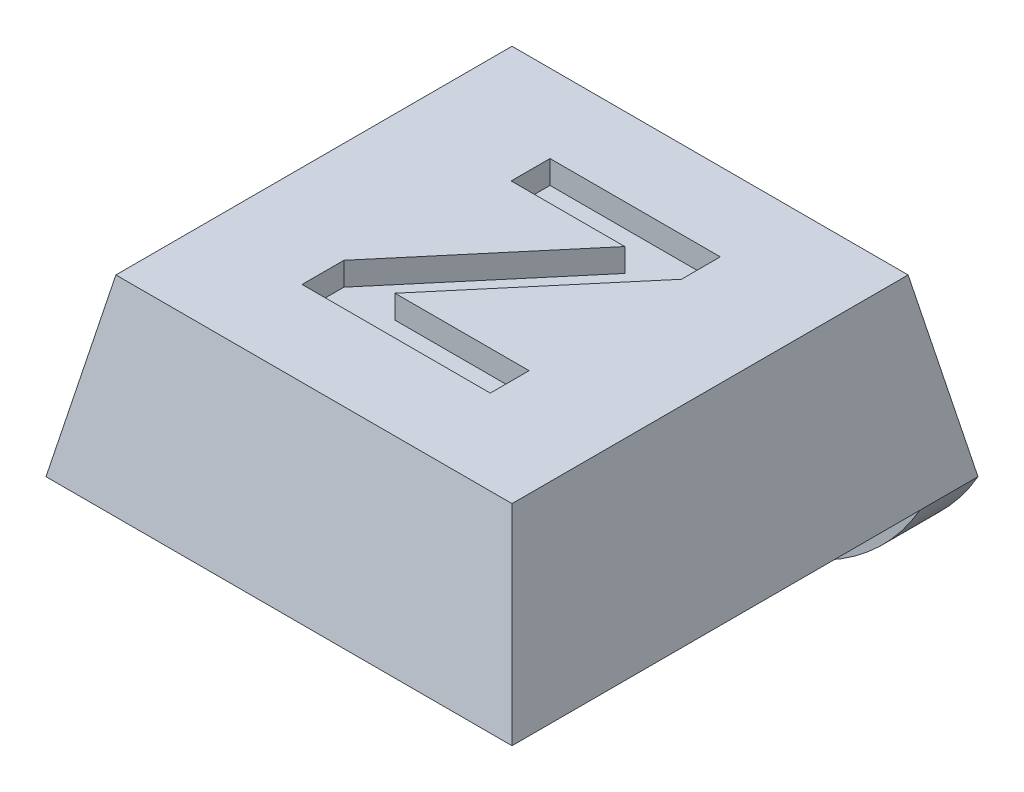
ISO-10303-21;
HEADER;
FILE_DESCRIPTION(('STEP AP214'),'2;1');
FILE_NAME('part.step','',(''),(''),'','','');
FILE_SCHEMA(('AUTOMOTIVE_DESIGN { 1 0 10303 214 1 1 1 1 }'));
ENDSEC;
DATA;
#1=APPLICATION_CONTEXT('core data for automotive mechanical design processes');
#2=APPLICATION_PROTOCOL_DEFINITION('international standard','automotive_design',2000,#1);
#3=PRODUCT_CONTEXT('',#1,'mechanical');
#4=PRODUCT('Part','Part','',(#3));
#5=PRODUCT_RELATED_PRODUCT_CATEGORY('part','',(#4));
#6=PRODUCT_DEFINITION_FORMATION('','',#4);
#7=PRODUCT_DEFINITION_CONTEXT('part definition',#1,'design');
#8=PRODUCT_DEFINITION('design','',#6,#7);
#9=PRODUCT_DEFINITION_SHAPE('','',#8);
#10=(LENGTH_UNIT() NAMED_UNIT(*) SI_UNIT(.MILLI.,.METRE.));
#11=(NAMED_UNIT(*) PLANE_ANGLE_UNIT() SI_UNIT($,.RADIAN.));
#12=(NAMED_UNIT(*) SI_UNIT($,.STERADIAN.) SOLID_ANGLE_UNIT());
#13=UNCERTAINTY_MEASURE_WITH_UNIT(LENGTH_MEASURE(1.E-05),#10,'distance_accuracy_value','');
#14=(GEOMETRIC_REPRESENTATION_CONTEXT(3) GLOBAL_UNCERTAINTY_ASSIGNED_CONTEXT((#13)) GLOBAL_UNIT_ASSIGNED_CONTEXT((#10,
#11,#12)) REPRESENTATION_CONTEXT('',''));
#15=CARTESIAN_POINT('',(0.,0.,0.));
#16=DIRECTION('',(0.,0.,1.));
#17=DIRECTION('',(1.,0.,0.));
#18=AXIS2_PLACEMENT_3D('',#15,#16,#17);
#19=CARTESIAN_POINT('',(0.,3.,0.));
#20=DIRECTION('',(0.,-1.,0.));
#21=DIRECTION('',(0.,0.,-1.));
#22=AXIS2_PLACEMENT_3D('',#19,#20,#21);
#23=PLANE('',#22);
#24=DIRECTION('',(-1.,0.,0.));
#25=VECTOR('',#24,1.);
#26=CARTESIAN_POINT('',(11.,3.,-0.6));
#27=LINE('',#26,#25);
#28=CARTESIAN_POINT('',(7.4,3.,-0.6));
#29=VERTEX_POINT('',#28);
#30=CARTESIAN_POINT('',(0.6,3.,-0.6));
#31=VERTEX_POINT('',#30);
#32=EDGE_CURVE('E218',#29,#31,#27,.T.);
#33=ORIENTED_EDGE('',*,*,#32,.F.);
#34=DIRECTION('',(0.,0.,1.));
#35=VECTOR('',#34,1.);
#36=CARTESIAN_POINT('',(7.4,3.,-8.));
#37=LINE('',#36,#35);
#38=CARTESIAN_POINT('',(7.4,3.,-7.4));
#39=VERTEX_POINT('',#38);
#40=EDGE_CURVE('E231',#39,#29,#37,.T.);
#41=ORIENTED_EDGE('',*,*,#40,.F.);
#42=DIRECTION('',(-1.,0.,0.));
#43=VECTOR('',#42,1.);
#44=CARTESIAN_POINT('',(11.,3.,-7.4));
#45=LINE('',#44,#43);
#46=CARTESIAN_POINT('',(0.599999999999999,3.,-7.4));
#47=VERTEX_POINT('',#46);
#48=EDGE_CURVE('E214',#39,#47,#45,.T.);
#49=ORIENTED_EDGE('',*,*,#48,.T.);
#50=DIRECTION('',(0.,0.,1.));
#51=VECTOR('',#50,1.);
#52=CARTESIAN_POINT('',(0.6,3.,-8.));
#53=LINE('',#52,#51);
#54=EDGE_CURVE('E234',#47,#31,#53,.T.);
#55=ORIENTED_EDGE('',*,*,#54,.T.);
#56=EDGE_LOOP('',(#33,#41,#49,#55));
#57=FACE_BOUND('',#56,.T.);
#58=DIRECTION('',(-1.,0.,0.));
#59=VECTOR('',#58,1.);
#60=CARTESIAN_POINT('',(5.57023744052671,3.,-2.05683246367483));
#61=LINE('',#60,#59);
#62=CARTESIAN_POINT('',(5.57023744052671,3.,-2.05683246367483));
#63=VERTEX_POINT('',#62);
#64=CARTESIAN_POINT('',(2.33946820975748,3.,-2.05683246367483));
#65=VERTEX_POINT('',#64);
#66=EDGE_CURVE('E59',#63,#65,#61,.T.);
#67=ORIENTED_EDGE('',*,*,#66,.T.);
#68=DIRECTION('',(0.,0.,-1.));
#69=VECTOR('',#68,1.);
#70=CARTESIAN_POINT('',(2.33946820975748,3.,-2.05683246367483));
#71=LINE('',#70,#69);
#72=CARTESIAN_POINT('',(2.33946820975748,3.,-2.77478118162354));
#73=VERTEX_POINT('',#72);
#74=EDGE_CURVE('E186',#65,#73,#71,.T.);
#75=ORIENTED_EDGE('',*,*,#74,.T.);
#76=DIRECTION('',(0.644870939209783,0.,-0.764291483507891));
#77=VECTOR('',#76,1.);
#78=CARTESIAN_POINT('',(2.33946820975748,3.,-2.77478118162354));
#79=LINE('',#78,#77);
#80=CARTESIAN_POINT('',(4.54619897898825,3.,-5.39016579700816));
#81=VERTEX_POINT('',#80);
#82=EDGE_CURVE('E625',#73,#81,#79,.T.);
#83=ORIENTED_EDGE('',*,*,#82,.T.);
#84=DIRECTION('',(-1.,0.,0.));
#85=VECTOR('',#84,1.);
#86=CARTESIAN_POINT('',(4.54619897898825,3.,-5.39016579700816));
#87=LINE('',#86,#85);
#88=CARTESIAN_POINT('',(2.59587846616773,3.,-5.39016579700816));
#89=VERTEX_POINT('',#88);
#90=EDGE_CURVE('E627',#81,#89,#87,.T.);
#91=ORIENTED_EDGE('',*,*,#90,.T.);
#92=DIRECTION('',(0.,0.,-1.));
#93=VECTOR('',#92,1.);
#94=CARTESIAN_POINT('',(2.59587846616773,3.,-5.39016579700816));
#95=LINE('',#94,#93);
#96=CARTESIAN_POINT('',(2.59587846616773,3.,-6.05683246367483));
#97=VERTEX_POINT('',#96);
#98=EDGE_CURVE('E632',#89,#97,#95,.T.);
#99=ORIENTED_EDGE('',*,*,#98,.T.);
#100=DIRECTION('',(1.,0.,0.));
#101=VECTOR('',#100,1.);
#102=CARTESIAN_POINT('',(2.59587846616773,3.,-6.05683246367483));
#103=LINE('',#102,#101);
#104=CARTESIAN_POINT('',(5.51895538924466,3.,-6.05683246367483));
#105=VERTEX_POINT('',#104);
#106=EDGE_CURVE('E642',#97,#105,#103,.T.);
#107=ORIENTED_EDGE('',*,*,#106,.T.);
#108=DIRECTION('',(0.,0.,1.));
#109=VECTOR('',#108,1.);
#110=CARTESIAN_POINT('',(5.51895538924466,3.,-6.05683246367483));
#111=LINE('',#110,#109);
#112=CARTESIAN_POINT('',(5.51895538924466,3.,-5.39016579700816));
#113=VERTEX_POINT('',#112);
#114=EDGE_CURVE('E597',#105,#113,#111,.T.);
#115=ORIENTED_EDGE('',*,*,#114,.T.);
#116=DIRECTION('',(-0.645005060359543,0.,0.76417829863886));
#117=VECTOR('',#116,1.);
#118=CARTESIAN_POINT('',(5.51895538924466,3.,-5.39016579700816));
#119=LINE('',#118,#117);
#120=CARTESIAN_POINT('',(3.26815410719337,3.,-2.72349913034149));
#121=VERTEX_POINT('',#120);
#122=EDGE_CURVE('E592',#113,#121,#119,.T.);
#123=ORIENTED_EDGE('',*,*,#122,.T.);
#124=DIRECTION('',(1.,0.,0.));
#125=VECTOR('',#124,1.);
#126=CARTESIAN_POINT('',(3.26815410719337,3.,-2.72349913034149));
#127=LINE('',#126,#125);
#128=CARTESIAN_POINT('',(5.57023744052671,3.,-2.72349913034149));
#129=VERTEX_POINT('',#128);
#130=EDGE_CURVE('E586',#121,#129,#127,.T.);
#131=ORIENTED_EDGE('',*,*,#130,.T.);
#132=DIRECTION('',(0.,0.,1.));
#133=VECTOR('',#132,1.);
#134=CARTESIAN_POINT('',(5.57023744052671,3.,-2.72349913034149));
#135=LINE('',#134,#133);
#136=EDGE_CURVE('E182',#129,#63,#135,.T.);
#137=ORIENTED_EDGE('',*,*,#136,.T.);
#138=EDGE_LOOP('',(#67,#75,#83,#91,#99,#107,#115,#123,#131,#137));
#139=FACE_BOUND('',#138,.T.);
#140=ADVANCED_FACE('F43',(#57,#139),#23,.F.);
#141=CARTESIAN_POINT('',(8.,0.,-8.));
#142=DIRECTION('',(-0.98058067569092,-0.196116135138184,0.));
#143=DIRECTION('',(0.196116135138184,-0.98058067569092,0.));
#144=AXIS2_PLACEMENT_3D('',#141,#142,#143);
#145=PLANE('',#144);
#146=DIRECTION('',(-0.192450089729875,0.962250448649376,-0.192450089729875));
#147=VECTOR('',#146,1.);
#148=CARTESIAN_POINT('',(7.7037037037037,1.48148148148148,-0.296296296296296));
#149=LINE('',#148,#147);
#150=CARTESIAN_POINT('',(8.,0.,0.));
#151=VERTEX_POINT('',#150);
#152=EDGE_CURVE('E228',#151,#29,#149,.T.);
#153=ORIENTED_EDGE('',*,*,#152,.F.);
#154=DIRECTION('',(0.,0.,-1.));
#155=VECTOR('',#154,1.);
#156=CARTESIAN_POINT('',(8.,0.,0.));
#157=LINE('',#156,#155);
#158=CARTESIAN_POINT('',(8.,0.,-7.));
#159=VERTEX_POINT('',#158);
#160=EDGE_CURVE('E247',#151,#159,#157,.T.);
#161=ORIENTED_EDGE('',*,*,#160,.T.);
#162=DIRECTION('',(0.,0.,1.));
#163=VECTOR('',#162,1.);
#164=CARTESIAN_POINT('',(8.,0.,-8.));
#165=LINE('',#164,#163);
#166=CARTESIAN_POINT('',(8.,0.,-8.));
#167=VERTEX_POINT('',#166);
#168=EDGE_CURVE('E188',#167,#159,#165,.T.);
#169=ORIENTED_EDGE('',*,*,#168,.F.);
#170=DIRECTION('',(0.192450089729875,-0.962250448649376,-0.192450089729875));
#171=VECTOR('',#170,1.);
#172=CARTESIAN_POINT('',(8.,0.,-8.));
#173=LINE('',#172,#171);
#174=EDGE_CURVE('E221',#39,#167,#173,.T.);
#175=ORIENTED_EDGE('',*,*,#174,.F.);
#176=ORIENTED_EDGE('',*,*,#40,.T.);
#177=EDGE_LOOP('',(#153,#161,#169,#175,#176));
#178=FACE_BOUND('',#177,.T.);
#179=ADVANCED_FACE('F315',(#178),#145,.F.);
#180=CARTESIAN_POINT('',(0.,0.,-8.));
#181=DIRECTION('',(0.98058067569092,-0.196116135138184,0.));
#182=DIRECTION('',(0.196116135138184,0.98058067569092,0.));
#183=AXIS2_PLACEMENT_3D('',#180,#181,#182);
#184=PLANE('',#183);
#185=DIRECTION('',(-0.192450089729875,-0.962250448649376,0.192450089729875));
#186=VECTOR('',#185,1.);
#187=CARTESIAN_POINT('',(0.296296296296296,1.48148148148148,-0.296296296296296));
#188=LINE('',#187,#186);
#189=CARTESIAN_POINT('',(0.,0.,0.));
#190=VERTEX_POINT('',#189);
#191=EDGE_CURVE('E275',#31,#190,#188,.T.);
#192=ORIENTED_EDGE('',*,*,#191,.F.);
#193=ORIENTED_EDGE('',*,*,#54,.F.);
#194=DIRECTION('',(0.192450089729875,0.962250448649376,0.192450089729875));
#195=VECTOR('',#194,1.);
#196=CARTESIAN_POINT('',(0.,0.,-8.));
#197=LINE('',#196,#195);
#198=CARTESIAN_POINT('',(0.,0.,-8.));
#199=VERTEX_POINT('',#198);
#200=EDGE_CURVE('E246',#199,#47,#197,.T.);
#201=ORIENTED_EDGE('',*,*,#200,.F.);
#202=DIRECTION('',(0.,0.,1.));
#203=VECTOR('',#202,1.);
#204=CARTESIAN_POINT('',(0.,0.,0.));
#205=LINE('',#204,#203);
#206=CARTESIAN_POINT('',(0.,0.,-7.));
#207=VERTEX_POINT('',#206);
#208=EDGE_CURVE('E251',#199,#207,#205,.T.);
#209=ORIENTED_EDGE('',*,*,#208,.T.);
#210=EDGE_CURVE('E238',#207,#190,#205,.T.);
#211=ORIENTED_EDGE('',*,*,#210,.T.);
#212=EDGE_LOOP('',(#192,#193,#201,#209,#211));
#213=FACE_BOUND('',#212,.T.);
#214=ADVANCED_FACE('F299',(#213),#184,.F.);
#215=CARTESIAN_POINT('',(0.,0.,0.));
#216=DIRECTION('',(0.,-1.,0.));
#217=DIRECTION('',(0.,0.,-1.));
#218=AXIS2_PLACEMENT_3D('',#215,#216,#217);
#219=PLANE('',#218);
#220=DIRECTION('',(-1.,0.,0.));
#221=VECTOR('',#220,1.);
#222=CARTESIAN_POINT('',(0.,0.,-7.));
#223=LINE('',#222,#221);
#224=EDGE_CURVE('E194',#159,#207,#223,.T.);
#225=ORIENTED_EDGE('',*,*,#224,.F.);
#226=ORIENTED_EDGE('',*,*,#160,.F.);
#227=DIRECTION('',(1.,0.,0.));
#228=VECTOR('',#227,1.);
#229=CARTESIAN_POINT('',(0.,0.,0.));
#230=LINE('',#229,#228);
#231=EDGE_CURVE('E248',#190,#151,#230,.T.);
#232=ORIENTED_EDGE('',*,*,#231,.F.);
#233=ORIENTED_EDGE('',*,*,#210,.F.);
#234=EDGE_LOOP('',(#225,#226,#232,#233));
#235=FACE_BOUND('',#234,.T.);
#236=CARTESIAN_POINT('',(4.,0.,-3.75));
#237=DIRECTION('',(0.,-1.,0.));
#238=DIRECTION('',(0.,0.,-1.));
#239=AXIS2_PLACEMENT_3D('',#236,#237,#238);
#240=CIRCLE('',#239,1.75);
#241=CARTESIAN_POINT('',(4.,0.,-5.5));
#242=VERTEX_POINT('',#241);
#243=EDGE_CURVE('E206',#242,#242,#240,.T.);
#244=ORIENTED_EDGE('',*,*,#243,.F.);
#245=EDGE_LOOP('',(#244));
#246=FACE_BOUND('',#245,.T.);
#247=ADVANCED_FACE('F310',(#235,#246),#219,.T.);
#248=CARTESIAN_POINT('',(11.,3.,-7.4));
#249=DIRECTION('',(0.,0.196116135138184,-0.98058067569092));
#250=DIRECTION('',(0.,0.98058067569092,0.196116135138184));
#251=AXIS2_PLACEMENT_3D('',#248,#249,#250);
#252=PLANE('',#251);
#253=ORIENTED_EDGE('',*,*,#174,.T.);
#254=DIRECTION('',(-1.,0.,0.));
#255=VECTOR('',#254,1.);
#256=CARTESIAN_POINT('',(0.,0.,-8.));
#257=LINE('',#256,#255);
#258=EDGE_CURVE('E242',#167,#199,#257,.T.);
#259=ORIENTED_EDGE('',*,*,#258,.T.);
#260=ORIENTED_EDGE('',*,*,#200,.T.);
#261=ORIENTED_EDGE('',*,*,#48,.F.);
#262=EDGE_LOOP('',(#253,#259,#260,#261));
#263=FACE_BOUND('',#262,.T.);
#264=ADVANCED_FACE('F294',(#263),#252,.T.);
#265=CARTESIAN_POINT('',(11.,0.,0.));
#266=DIRECTION('',(0.,0.196116135138184,0.98058067569092));
#267=DIRECTION('',(0.,-0.98058067569092,0.196116135138184));
#268=AXIS2_PLACEMENT_3D('',#265,#266,#267);
#269=PLANE('',#268);
#270=ORIENTED_EDGE('',*,*,#152,.T.);
#271=ORIENTED_EDGE('',*,*,#32,.T.);
#272=ORIENTED_EDGE('',*,*,#191,.T.);
#273=ORIENTED_EDGE('',*,*,#231,.T.);
#274=EDGE_LOOP('',(#270,#271,#272,#273));
#275=FACE_BOUND('',#274,.T.);
#276=ADVANCED_FACE('F339',(#275),#269,.T.);
#277=CARTESIAN_POINT('',(4.,0.4,-3.75));
#278=DIRECTION('',(0.,-1.,0.));
#279=DIRECTION('',(0.,0.,-1.));
#280=AXIS2_PLACEMENT_3D('',#277,#278,#279);
#281=CYLINDRICAL_SURFACE('',#280,1.75);
#282=CARTESIAN_POINT('',(4.,0.4,-3.75));
#283=DIRECTION('',(0.,-1.,0.));
#284=DIRECTION('',(0.,0.,-1.));
#285=AXIS2_PLACEMENT_3D('',#282,#283,#284);
#286=CIRCLE('',#285,1.75);
#287=CARTESIAN_POINT('',(4.,0.4,-5.5));
#288=VERTEX_POINT('',#287);
#289=EDGE_CURVE('E210',#288,#288,#286,.T.);
#290=ORIENTED_EDGE('',*,*,#289,.F.);
#291=EDGE_LOOP('',(#290));
#292=FACE_BOUND('',#291,.T.);
#293=ORIENTED_EDGE('',*,*,#243,.T.);
#294=EDGE_LOOP('',(#293));
#295=FACE_BOUND('',#294,.T.);
#296=ADVANCED_FACE('F346',(#292,#295),#281,.F.);
#297=CARTESIAN_POINT('',(4.,0.4,-3.75));
#298=DIRECTION('',(0.,-1.,0.));
#299=DIRECTION('',(0.,0.,-1.));
#300=AXIS2_PLACEMENT_3D('',#297,#298,#299);
#301=PLANE('',#300);
#302=ORIENTED_EDGE('',*,*,#289,.T.);
#303=EDGE_LOOP('',(#302));
#304=FACE_BOUND('',#303,.T.);
#305=ADVANCED_FACE('F350',(#304),#301,.T.);
#306=CARTESIAN_POINT('',(0.,-2.,-8.));
#307=DIRECTION('',(0.,0.,1.));
#308=DIRECTION('',(1.,0.,0.));
#309=AXIS2_PLACEMENT_3D('',#306,#307,#308);
#310=PLANE('',#309);
#311=ORIENTED_EDGE('',*,*,#258,.F.);
#312=CARTESIAN_POINT('',(4.53589838486225,2.,-8.));
#313=DIRECTION('',(0.,0.,1.));
#314=DIRECTION('',(1.,0.,0.));
#315=AXIS2_PLACEMENT_3D('',#312,#313,#314);
#316=CIRCLE('',#315,4.);
#317=CARTESIAN_POINT('',(4.53589838486225,-2.,-8.));
#318=VERTEX_POINT('',#317);
#319=EDGE_CURVE('E11',#167,#318,#316,.F.);
#320=ORIENTED_EDGE('',*,*,#319,.T.);
#321=DIRECTION('',(1.,0.,0.));
#322=VECTOR('',#321,1.);
#323=CARTESIAN_POINT('',(0.,-2.,-8.));
#324=LINE('',#323,#322);
#325=CARTESIAN_POINT('',(3.46410161513775,-2.,-8.));
#326=VERTEX_POINT('',#325);
#327=EDGE_CURVE('E200',#326,#318,#324,.T.);
#328=ORIENTED_EDGE('',*,*,#327,.F.);
#329=CARTESIAN_POINT('',(3.46410161513775,2.,-8.));
#330=DIRECTION('',(0.,0.,1.));
#331=DIRECTION('',(1.,0.,0.));
#332=AXIS2_PLACEMENT_3D('',#329,#330,#331);
#333=CIRCLE('',#332,4.);
#334=EDGE_CURVE('E52',#326,#199,#333,.F.);
#335=ORIENTED_EDGE('',*,*,#334,.T.);
#336=EDGE_LOOP('',(#311,#320,#328,#335));
#337=FACE_BOUND('',#336,.T.);
#338=ADVANCED_FACE('F287',(#337),#310,.F.);
#339=CARTESIAN_POINT('',(0.,-2.,-7.));
#340=DIRECTION('',(0.,0.,-1.));
#341=DIRECTION('',(-1.,0.,0.));
#342=AXIS2_PLACEMENT_3D('',#339,#340,#341);
#343=PLANE('',#342);
#344=DIRECTION('',(-1.,0.,0.));
#345=VECTOR('',#344,1.);
#346=CARTESIAN_POINT('',(0.,-2.,-7.));
#347=LINE('',#346,#345);
#348=CARTESIAN_POINT('',(4.53589838486225,-2.,-7.));
#349=VERTEX_POINT('',#348);
#350=CARTESIAN_POINT('',(3.46410161513775,-2.,-7.));
#351=VERTEX_POINT('',#350);
#352=EDGE_CURVE('E204',#349,#351,#347,.T.);
#353=ORIENTED_EDGE('',*,*,#352,.F.);
#354=CARTESIAN_POINT('',(4.53589838486225,2.,-7.));
#355=DIRECTION('',(0.,0.,-1.));
#356=DIRECTION('',(-1.,0.,0.));
#357=AXIS2_PLACEMENT_3D('',#354,#355,#356);
#358=CIRCLE('',#357,4.);
#359=EDGE_CURVE('E281',#349,#159,#358,.F.);
#360=ORIENTED_EDGE('',*,*,#359,.T.);
#361=ORIENTED_EDGE('',*,*,#224,.T.);
#362=CARTESIAN_POINT('',(3.46410161513775,2.,-7.));
#363=DIRECTION('',(0.,0.,-1.));
#364=DIRECTION('',(-1.,0.,0.));
#365=AXIS2_PLACEMENT_3D('',#362,#363,#364);
#366=CIRCLE('',#365,4.);
#367=EDGE_CURVE('E67',#207,#351,#366,.F.);
#368=ORIENTED_EDGE('',*,*,#367,.T.);
#369=EDGE_LOOP('',(#353,#360,#361,#368));
#370=FACE_BOUND('',#369,.T.);
#371=ADVANCED_FACE('F305',(#370),#343,.F.);
#372=CARTESIAN_POINT('',(0.,-2.,0.));
#373=DIRECTION('',(0.,1.,0.));
#374=DIRECTION('',(0.,0.,1.));
#375=AXIS2_PLACEMENT_3D('',#372,#373,#374);
#376=PLANE('',#375);
#377=ORIENTED_EDGE('',*,*,#327,.T.);
#378=DIRECTION('',(0.,0.,1.));
#379=VECTOR('',#378,1.);
#380=CARTESIAN_POINT('',(4.53589838486225,-2.,0.));
#381=LINE('',#380,#379);
#382=EDGE_CURVE('E274',#318,#349,#381,.T.);
#383=ORIENTED_EDGE('',*,*,#382,.T.);
#384=ORIENTED_EDGE('',*,*,#352,.T.);
#385=DIRECTION('',(0.,0.,-1.));
#386=VECTOR('',#385,1.);
#387=CARTESIAN_POINT('',(3.46410161513775,-2.,0.));
#388=LINE('',#387,#386);
#389=EDGE_CURVE('E270',#351,#326,#388,.T.);
#390=ORIENTED_EDGE('',*,*,#389,.T.);
#391=EDGE_LOOP('',(#377,#383,#384,#390));
#392=FACE_BOUND('',#391,.T.);
#393=ADVANCED_FACE('F303',(#392),#376,.F.);
#394=CARTESIAN_POINT('',(4.53589838486225,2.,-8.));
#395=DIRECTION('',(0.,0.,1.));
#396=DIRECTION('',(1.,0.,0.));
#397=AXIS2_PLACEMENT_3D('',#394,#395,#396);
#398=CYLINDRICAL_SURFACE('',#397,4.);
#399=ORIENTED_EDGE('',*,*,#319,.F.);
#400=ORIENTED_EDGE('',*,*,#168,.T.);
#401=ORIENTED_EDGE('',*,*,#359,.F.);
#402=ORIENTED_EDGE('',*,*,#382,.F.);
#403=EDGE_LOOP('',(#399,#400,#401,#402));
#404=FACE_BOUND('',#403,.T.);
#405=ADVANCED_FACE('F316',(#404),#398,.T.);
#406=CARTESIAN_POINT('',(3.46410161513775,2.,-8.));
#407=DIRECTION('',(0.,0.,-1.));
#408=DIRECTION('',(-1.,0.,0.));
#409=AXIS2_PLACEMENT_3D('',#406,#407,#408);
#410=CYLINDRICAL_SURFACE('',#409,4.);
#411=ORIENTED_EDGE('',*,*,#367,.F.);
#412=ORIENTED_EDGE('',*,*,#208,.F.);
#413=ORIENTED_EDGE('',*,*,#334,.F.);
#414=ORIENTED_EDGE('',*,*,#389,.F.);
#415=EDGE_LOOP('',(#411,#412,#413,#414));
#416=FACE_BOUND('',#415,.T.);
#417=ADVANCED_FACE('F45',(#416),#410,.T.);
#418=CARTESIAN_POINT('',(5.57023744052671,2.6,-2.05683246367483));
#419=DIRECTION('',(0.,0.,-1.));
#420=DIRECTION('',(-1.,0.,0.));
#421=AXIS2_PLACEMENT_3D('',#418,#419,#420);
#422=PLANE('',#421);
#423=ORIENTED_EDGE('',*,*,#66,.F.);
#424=DIRECTION('',(0.,1.,0.));
#425=VECTOR('',#424,1.);
#426=CARTESIAN_POINT('',(5.57023744052671,2.6,-2.05683246367483));
#427=LINE('',#426,#425);
#428=CARTESIAN_POINT('',(5.57023744052671,2.6,-2.05683246367483));
#429=VERTEX_POINT('',#428);
#430=EDGE_CURVE('E180',#429,#63,#427,.T.);
#431=ORIENTED_EDGE('',*,*,#430,.F.);
#432=DIRECTION('',(-1.,0.,0.));
#433=VECTOR('',#432,1.);
#434=CARTESIAN_POINT('',(5.57023744052671,2.6,-2.05683246367483));
#435=LINE('',#434,#433);
#436=CARTESIAN_POINT('',(2.33946820975748,2.6,-2.05683246367483));
#437=VERTEX_POINT('',#436);
#438=EDGE_CURVE('E170',#429,#437,#435,.T.);
#439=ORIENTED_EDGE('',*,*,#438,.T.);
#440=DIRECTION('',(0.,1.,0.));
#441=VECTOR('',#440,1.);
#442=CARTESIAN_POINT('',(2.33946820975748,2.6,-2.05683246367483));
#443=LINE('',#442,#441);
#444=EDGE_CURVE('E179',#437,#65,#443,.T.);
#445=ORIENTED_EDGE('',*,*,#444,.T.);
#446=EDGE_LOOP('',(#423,#431,#439,#445));
#447=FACE_BOUND('',#446,.T.);
#448=ADVANCED_FACE('F178',(#447),#422,.T.);
#449=CARTESIAN_POINT('',(2.33946820975748,2.6,-2.05683246367483));
#450=DIRECTION('',(1.,0.,0.));
#451=DIRECTION('',(0.,0.,-1.));
#452=AXIS2_PLACEMENT_3D('',#449,#450,#451);
#453=PLANE('',#452);
#454=ORIENTED_EDGE('',*,*,#74,.F.);
#455=ORIENTED_EDGE('',*,*,#444,.F.);
#456=DIRECTION('',(0.,0.,-1.));
#457=VECTOR('',#456,1.);
#458=CARTESIAN_POINT('',(2.33946820975748,2.6,-2.05683246367483));
#459=LINE('',#458,#457);
#460=CARTESIAN_POINT('',(2.33946820975748,2.6,-2.77478118162354));
#461=VERTEX_POINT('',#460);
#462=EDGE_CURVE('E166',#437,#461,#459,.T.);
#463=ORIENTED_EDGE('',*,*,#462,.T.);
#464=DIRECTION('',(0.,1.,0.));
#465=VECTOR('',#464,1.);
#466=CARTESIAN_POINT('',(2.33946820975748,2.6,-2.77478118162354));
#467=LINE('',#466,#465);
#468=EDGE_CURVE('E189',#461,#73,#467,.T.);
#469=ORIENTED_EDGE('',*,*,#468,.T.);
#470=EDGE_LOOP('',(#454,#455,#463,#469));
#471=FACE_BOUND('',#470,.T.);
#472=ADVANCED_FACE('F184',(#471),#453,.T.);
#473=CARTESIAN_POINT('',(2.33946820975748,2.6,-2.77478118162354));
#474=DIRECTION('',(0.764291483507891,0.,0.644870939209783));
#475=DIRECTION('',(0.644870939209783,0.,-0.764291483507891));
#476=AXIS2_PLACEMENT_3D('',#473,#474,#475);
#477=PLANE('',#476);
#478=ORIENTED_EDGE('',*,*,#82,.F.);
#479=ORIENTED_EDGE('',*,*,#468,.F.);
#480=DIRECTION('',(0.644870939209783,0.,-0.764291483507891));
#481=VECTOR('',#480,1.);
#482=CARTESIAN_POINT('',(2.33946820975748,2.6,-2.77478118162354));
#483=LINE('',#482,#481);
#484=CARTESIAN_POINT('',(4.54619897898825,2.6,-5.39016579700816));
#485=VERTEX_POINT('',#484);
#486=EDGE_CURVE('E172',#461,#485,#483,.T.);
#487=ORIENTED_EDGE('',*,*,#486,.T.);
#488=DIRECTION('',(0.,1.,0.));
#489=VECTOR('',#488,1.);
#490=CARTESIAN_POINT('',(4.54619897898825,2.6,-5.39016579700816));
#491=LINE('',#490,#489);
#492=EDGE_CURVE('E196',#485,#81,#491,.T.);
#493=ORIENTED_EDGE('',*,*,#492,.T.);
#494=EDGE_LOOP('',(#478,#479,#487,#493));
#495=FACE_BOUND('',#494,.T.);
#496=ADVANCED_FACE('F363',(#495),#477,.T.);
#497=CARTESIAN_POINT('',(4.54619897898825,2.6,-5.39016579700816));
#498=DIRECTION('',(0.,0.,-1.));
#499=DIRECTION('',(-1.,0.,0.));
#500=AXIS2_PLACEMENT_3D('',#497,#498,#499);
#501=PLANE('',#500);
#502=ORIENTED_EDGE('',*,*,#90,.F.);
#503=ORIENTED_EDGE('',*,*,#492,.F.);
#504=DIRECTION('',(-1.,0.,0.));
#505=VECTOR('',#504,1.);
#506=CARTESIAN_POINT('',(4.54619897898825,2.6,-5.39016579700816));
#507=LINE('',#506,#505);
#508=CARTESIAN_POINT('',(2.59587846616773,2.6,-5.39016579700816));
#509=VERTEX_POINT('',#508);
#510=EDGE_CURVE('E672',#485,#509,#507,.T.);
#511=ORIENTED_EDGE('',*,*,#510,.T.);
#512=DIRECTION('',(0.,1.,0.));
#513=VECTOR('',#512,1.);
#514=CARTESIAN_POINT('',(2.59587846616773,2.6,-5.39016579700816));
#515=LINE('',#514,#513);
#516=EDGE_CURVE('E618',#509,#89,#515,.T.);
#517=ORIENTED_EDGE('',*,*,#516,.T.);
#518=EDGE_LOOP('',(#502,#503,#511,#517));
#519=FACE_BOUND('',#518,.T.);
#520=ADVANCED_FACE('F366',(#519),#501,.T.);
#521=CARTESIAN_POINT('',(2.59587846616773,2.6,-5.39016579700816));
#522=DIRECTION('',(1.,0.,0.));
#523=DIRECTION('',(0.,0.,-1.));
#524=AXIS2_PLACEMENT_3D('',#521,#522,#523);
#525=PLANE('',#524);
#526=ORIENTED_EDGE('',*,*,#98,.F.);
#527=ORIENTED_EDGE('',*,*,#516,.F.);
#528=DIRECTION('',(0.,0.,-1.));
#529=VECTOR('',#528,1.);
#530=CARTESIAN_POINT('',(2.59587846616773,2.6,-5.39016579700816));
#531=LINE('',#530,#529);
#532=CARTESIAN_POINT('',(2.59587846616773,2.6,-6.05683246367483));
#533=VERTEX_POINT('',#532);
#534=EDGE_CURVE('E669',#509,#533,#531,.T.);
#535=ORIENTED_EDGE('',*,*,#534,.T.);
#536=DIRECTION('',(0.,1.,0.));
#537=VECTOR('',#536,1.);
#538=CARTESIAN_POINT('',(2.59587846616773,2.6,-6.05683246367483));
#539=LINE('',#538,#537);
#540=EDGE_CURVE('E615',#533,#97,#539,.T.);
#541=ORIENTED_EDGE('',*,*,#540,.T.);
#542=EDGE_LOOP('',(#526,#527,#535,#541));
#543=FACE_BOUND('',#542,.T.);
#544=ADVANCED_FACE('F370',(#543),#525,.T.);
#545=CARTESIAN_POINT('',(2.59587846616773,2.6,-6.05683246367483));
#546=DIRECTION('',(0.,0.,1.));
#547=DIRECTION('',(1.,0.,0.));
#548=AXIS2_PLACEMENT_3D('',#545,#546,#547);
#549=PLANE('',#548);
#550=ORIENTED_EDGE('',*,*,#106,.F.);
#551=ORIENTED_EDGE('',*,*,#540,.F.);
#552=DIRECTION('',(1.,0.,0.));
#553=VECTOR('',#552,1.);
#554=CARTESIAN_POINT('',(2.59587846616773,2.6,-6.05683246367483));
#555=LINE('',#554,#553);
#556=CARTESIAN_POINT('',(5.51895538924466,2.6,-6.05683246367483));
#557=VERTEX_POINT('',#556);
#558=EDGE_CURVE('E666',#533,#557,#555,.T.);
#559=ORIENTED_EDGE('',*,*,#558,.T.);
#560=DIRECTION('',(0.,1.,0.));
#561=VECTOR('',#560,1.);
#562=CARTESIAN_POINT('',(5.51895538924466,2.6,-6.05683246367483));
#563=LINE('',#562,#561);
#564=EDGE_CURVE('E612',#557,#105,#563,.T.);
#565=ORIENTED_EDGE('',*,*,#564,.T.);
#566=EDGE_LOOP('',(#550,#551,#559,#565));
#567=FACE_BOUND('',#566,.T.);
#568=ADVANCED_FACE('F374',(#567),#549,.T.);
#569=CARTESIAN_POINT('',(5.51895538924466,2.6,-6.05683246367483));
#570=DIRECTION('',(-1.,0.,0.));
#571=DIRECTION('',(0.,0.,1.));
#572=AXIS2_PLACEMENT_3D('',#569,#570,#571);
#573=PLANE('',#572);
#574=ORIENTED_EDGE('',*,*,#114,.F.);
#575=ORIENTED_EDGE('',*,*,#564,.F.);
#576=DIRECTION('',(0.,0.,1.));
#577=VECTOR('',#576,1.);
#578=CARTESIAN_POINT('',(5.51895538924466,2.6,-6.05683246367483));
#579=LINE('',#578,#577);
#580=CARTESIAN_POINT('',(5.51895538924466,2.6,-5.39016579700816));
#581=VERTEX_POINT('',#580);
#582=EDGE_CURVE('E651',#557,#581,#579,.T.);
#583=ORIENTED_EDGE('',*,*,#582,.T.);
#584=DIRECTION('',(0.,1.,0.));
#585=VECTOR('',#584,1.);
#586=CARTESIAN_POINT('',(5.51895538924466,2.6,-5.39016579700816));
#587=LINE('',#586,#585);
#588=EDGE_CURVE('E609',#581,#113,#587,.T.);
#589=ORIENTED_EDGE('',*,*,#588,.T.);
#590=EDGE_LOOP('',(#574,#575,#583,#589));
#591=FACE_BOUND('',#590,.T.);
#592=ADVANCED_FACE('F378',(#591),#573,.T.);
#593=CARTESIAN_POINT('',(5.51895538924466,2.6,-5.39016579700816));
#594=DIRECTION('',(-0.76417829863886,0.,-0.645005060359543));
#595=DIRECTION('',(-0.645005060359543,0.,0.76417829863886));
#596=AXIS2_PLACEMENT_3D('',#593,#594,#595);
#597=PLANE('',#596);
#598=ORIENTED_EDGE('',*,*,#122,.F.);
#599=ORIENTED_EDGE('',*,*,#588,.F.);
#600=DIRECTION('',(-0.645005060359543,0.,0.76417829863886));
#601=VECTOR('',#600,1.);
#602=CARTESIAN_POINT('',(5.51895538924466,2.6,-5.39016579700816));
#603=LINE('',#602,#601);
#604=CARTESIAN_POINT('',(3.26815410719337,2.6,-2.72349913034149));
#605=VERTEX_POINT('',#604);
#606=EDGE_CURVE('E653',#581,#605,#603,.T.);
#607=ORIENTED_EDGE('',*,*,#606,.T.);
#608=DIRECTION('',(0.,1.,0.));
#609=VECTOR('',#608,1.);
#610=CARTESIAN_POINT('',(3.26815410719337,2.6,-2.72349913034149));
#611=LINE('',#610,#609);
#612=EDGE_CURVE('E606',#605,#121,#611,.T.);
#613=ORIENTED_EDGE('',*,*,#612,.T.);
#614=EDGE_LOOP('',(#598,#599,#607,#613));
#615=FACE_BOUND('',#614,.T.);
#616=ADVANCED_FACE('F382',(#615),#597,.T.);
#617=CARTESIAN_POINT('',(3.26815410719337,2.6,-2.72349913034149));
#618=DIRECTION('',(0.,0.,1.));
#619=DIRECTION('',(1.,0.,0.));
#620=AXIS2_PLACEMENT_3D('',#617,#618,#619);
#621=PLANE('',#620);
#622=ORIENTED_EDGE('',*,*,#130,.F.);
#623=ORIENTED_EDGE('',*,*,#612,.F.);
#624=DIRECTION('',(1.,0.,0.));
#625=VECTOR('',#624,1.);
#626=CARTESIAN_POINT('',(3.26815410719337,2.6,-2.72349913034149));
#627=LINE('',#626,#625);
#628=CARTESIAN_POINT('',(5.57023744052671,2.6,-2.72349913034149));
#629=VERTEX_POINT('',#628);
#630=EDGE_CURVE('E655',#605,#629,#627,.T.);
#631=ORIENTED_EDGE('',*,*,#630,.T.);
#632=DIRECTION('',(0.,1.,0.));
#633=VECTOR('',#632,1.);
#634=CARTESIAN_POINT('',(5.57023744052671,2.6,-2.72349913034149));
#635=LINE('',#634,#633);
#636=EDGE_CURVE('E584',#629,#129,#635,.T.);
#637=ORIENTED_EDGE('',*,*,#636,.T.);
#638=EDGE_LOOP('',(#622,#623,#631,#637));
#639=FACE_BOUND('',#638,.T.);
#640=ADVANCED_FACE('F386',(#639),#621,.T.);
#641=CARTESIAN_POINT('',(5.57023744052671,2.6,-2.72349913034149));
#642=DIRECTION('',(-1.,0.,0.));
#643=DIRECTION('',(0.,0.,1.));
#644=AXIS2_PLACEMENT_3D('',#641,#642,#643);
#645=PLANE('',#644);
#646=ORIENTED_EDGE('',*,*,#136,.F.);
#647=ORIENTED_EDGE('',*,*,#636,.F.);
#648=DIRECTION('',(0.,0.,1.));
#649=VECTOR('',#648,1.);
#650=CARTESIAN_POINT('',(5.57023744052671,2.6,-2.72349913034149));
#651=LINE('',#650,#649);
#652=EDGE_CURVE('E603',#629,#429,#651,.T.);
#653=ORIENTED_EDGE('',*,*,#652,.T.);
#654=ORIENTED_EDGE('',*,*,#430,.T.);
#655=EDGE_LOOP('',(#646,#647,#653,#654));
#656=FACE_BOUND('',#655,.T.);
#657=ADVANCED_FACE('F390',(#656),#645,.T.);
#658=CARTESIAN_POINT('',(0.,2.6,0.));
#659=DIRECTION('',(0.,-1.,0.));
#660=DIRECTION('',(0.,0.,-1.));
#661=AXIS2_PLACEMENT_3D('',#658,#659,#660);
#662=PLANE('',#661);
#663=ORIENTED_EDGE('',*,*,#438,.F.);
#664=ORIENTED_EDGE('',*,*,#652,.F.);
#665=ORIENTED_EDGE('',*,*,#630,.F.);
#666=ORIENTED_EDGE('',*,*,#606,.F.);
#667=ORIENTED_EDGE('',*,*,#582,.F.);
#668=ORIENTED_EDGE('',*,*,#558,.F.);
#669=ORIENTED_EDGE('',*,*,#534,.F.);
#670=ORIENTED_EDGE('',*,*,#510,.F.);
#671=ORIENTED_EDGE('',*,*,#486,.F.);
#672=ORIENTED_EDGE('',*,*,#462,.F.);
#673=EDGE_LOOP('',(#663,#664,#665,#666,#667,#668,#669,#670,#671,#672));
#674=FACE_BOUND('',#673,.T.);
#675=ADVANCED_FACE('F168',(#674),#662,.F.);
#676=CLOSED_SHELL('',(#140,#179,#214,#247,#264,#276,#296,#305,#338,#371,#393,#405,#417,#448,
#472,#496,#520,#544,#568,#592,#616,#640,#657,#675));
#677=MANIFOLD_SOLID_BREP('B2',#676);
#678=ADVANCED_BREP_SHAPE_REPRESENTATION('',(#18,#677),#14);
#679=SHAPE_DEFINITION_REPRESENTATION(#9,#678);
ENDSEC;
END-ISO-10303-21;
